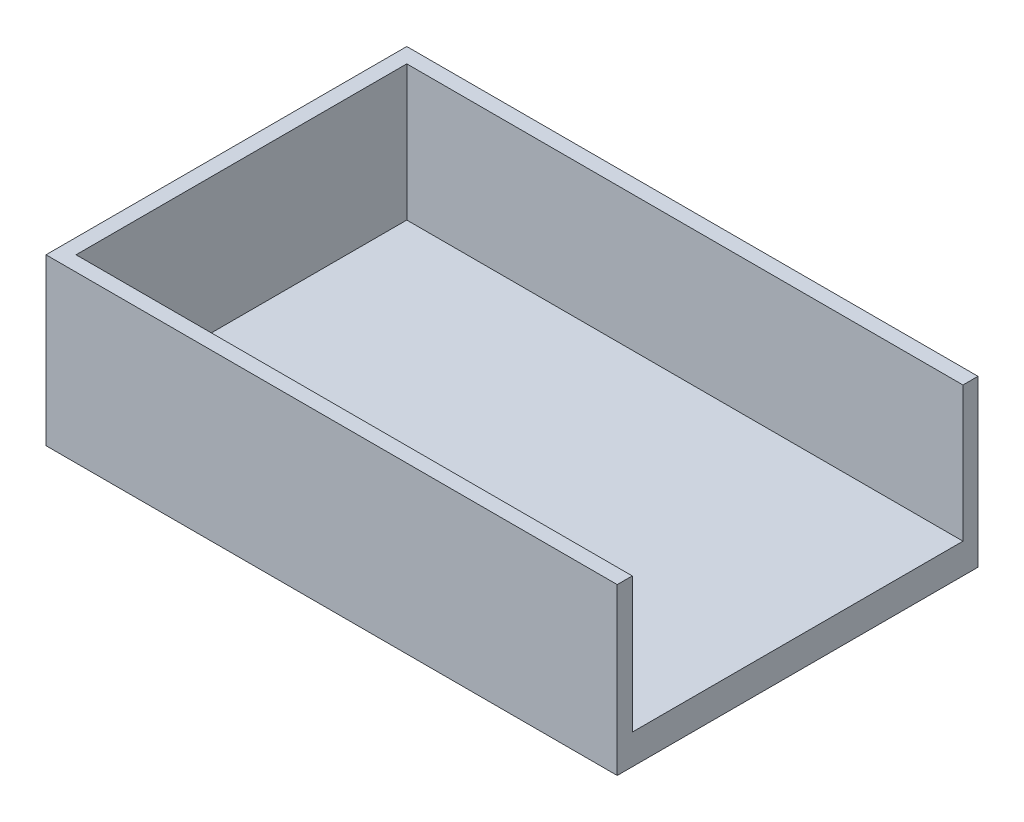
ISO-10303-21;
HEADER;
FILE_DESCRIPTION(('STEP AP214'),'2;1');
FILE_NAME('part.step','',(''),(''),'','','');
FILE_SCHEMA(('AUTOMOTIVE_DESIGN { 1 0 10303 214 1 1 1 1 }'));
ENDSEC;
DATA;
#1=APPLICATION_CONTEXT('core data for automotive mechanical design processes');
#2=APPLICATION_PROTOCOL_DEFINITION('international standard','automotive_design',2000,#1);
#3=PRODUCT_CONTEXT('',#1,'mechanical');
#4=PRODUCT('Part','Part','',(#3));
#5=PRODUCT_RELATED_PRODUCT_CATEGORY('part','',(#4));
#6=PRODUCT_DEFINITION_FORMATION('','',#4);
#7=PRODUCT_DEFINITION_CONTEXT('part definition',#1,'design');
#8=PRODUCT_DEFINITION('design','',#6,#7);
#9=PRODUCT_DEFINITION_SHAPE('','',#8);
#10=(LENGTH_UNIT() NAMED_UNIT(*) SI_UNIT(.MILLI.,.METRE.));
#11=(NAMED_UNIT(*) PLANE_ANGLE_UNIT() SI_UNIT($,.RADIAN.));
#12=(NAMED_UNIT(*) SI_UNIT($,.STERADIAN.) SOLID_ANGLE_UNIT());
#13=UNCERTAINTY_MEASURE_WITH_UNIT(LENGTH_MEASURE(1.E-05),#10,'distance_accuracy_value','');
#14=(GEOMETRIC_REPRESENTATION_CONTEXT(3) GLOBAL_UNCERTAINTY_ASSIGNED_CONTEXT((#13)) GLOBAL_UNIT_ASSIGNED_CONTEXT((#10,
#11,#12)) REPRESENTATION_CONTEXT('',''));
#15=CARTESIAN_POINT('',(0.,0.,0.));
#16=DIRECTION('',(0.,0.,1.));
#17=DIRECTION('',(1.,0.,0.));
#18=AXIS2_PLACEMENT_3D('',#15,#16,#17);
#19=CARTESIAN_POINT('',(0.,2.,0.));
#20=DIRECTION('',(0.,-1.,0.));
#21=DIRECTION('',(0.,0.,-1.));
#22=AXIS2_PLACEMENT_3D('',#19,#20,#21);
#23=PLANE('',#22);
#24=DIRECTION('',(1.,0.,0.));
#25=VECTOR('',#24,1.);
#26=CARTESIAN_POINT('',(3.,2.,-1.));
#27=LINE('',#26,#25);
#28=CARTESIAN_POINT('',(1.,2.,-1.));
#29=VERTEX_POINT('',#28);
#30=CARTESIAN_POINT('',(3.,2.,-1.));
#31=VERTEX_POINT('',#30);
#32=EDGE_CURVE('E197',#29,#31,#27,.T.);
#33=ORIENTED_EDGE('',*,*,#32,.T.);
#34=DIRECTION('',(0.,0.,1.));
#35=VECTOR('',#34,1.);
#36=CARTESIAN_POINT('',(3.,2.,-4.));
#37=LINE('',#36,#35);
#38=CARTESIAN_POINT('',(3.,2.,-4.));
#39=VERTEX_POINT('',#38);
#40=EDGE_CURVE('E151',#39,#31,#37,.T.);
#41=ORIENTED_EDGE('',*,*,#40,.F.);
#42=DIRECTION('',(-1.,0.,0.));
#43=VECTOR('',#42,1.);
#44=CARTESIAN_POINT('',(4.,2.,-4.));
#45=LINE('',#44,#43);
#46=CARTESIAN_POINT('',(8.,2.,-4.));
#47=VERTEX_POINT('',#46);
#48=EDGE_CURVE('E143',#47,#39,#45,.T.);
#49=ORIENTED_EDGE('',*,*,#48,.F.);
#50=DIRECTION('',(0.,0.,-1.));
#51=VECTOR('',#50,1.);
#52=CARTESIAN_POINT('',(8.,2.,-1.));
#53=LINE('',#52,#51);
#54=CARTESIAN_POINT('',(8.,2.,-1.));
#55=VERTEX_POINT('',#54);
#56=EDGE_CURVE('E61',#55,#47,#53,.T.);
#57=ORIENTED_EDGE('',*,*,#56,.F.);
#58=CARTESIAN_POINT('',(38.,2.,-1.));
#59=VERTEX_POINT('',#58);
#60=EDGE_CURVE('E188',#55,#59,#27,.T.);
#61=ORIENTED_EDGE('',*,*,#60,.T.);
#62=DIRECTION('',(0.,0.,1.));
#63=VECTOR('',#62,1.);
#64=CARTESIAN_POINT('',(38.,2.,0.));
#65=LINE('',#64,#63);
#66=CARTESIAN_POINT('',(38.,2.,-23.));
#67=VERTEX_POINT('',#66);
#68=EDGE_CURVE('E176',#67,#59,#65,.T.);
#69=ORIENTED_EDGE('',*,*,#68,.F.);
#70=DIRECTION('',(-1.,0.,0.));
#71=VECTOR('',#70,1.);
#72=CARTESIAN_POINT('',(3.,2.,-23.));
#73=LINE('',#72,#71);
#74=CARTESIAN_POINT('',(1.,2.,-23.));
#75=VERTEX_POINT('',#74);
#76=EDGE_CURVE('E194',#67,#75,#73,.T.);
#77=ORIENTED_EDGE('',*,*,#76,.T.);
#78=DIRECTION('',(0.,0.,-1.));
#79=VECTOR('',#78,1.);
#80=CARTESIAN_POINT('',(1.,2.,-1.));
#81=LINE('',#80,#79);
#82=EDGE_CURVE('E159',#29,#75,#81,.T.);
#83=ORIENTED_EDGE('',*,*,#82,.F.);
#84=EDGE_LOOP('',(#33,#41,#49,#57,#61,#69,#77,#83));
#85=FACE_BOUND('',#84,.T.);
#86=ADVANCED_FACE('F39',(#85),#23,.F.);
#87=CARTESIAN_POINT('',(0.,2.,0.));
#88=DIRECTION('',(0.,0.,-1.));
#89=DIRECTION('',(-1.,0.,0.));
#90=AXIS2_PLACEMENT_3D('',#87,#88,#89);
#91=PLANE('',#90);
#92=DIRECTION('',(0.,-1.,0.));
#93=VECTOR('',#92,1.);
#94=CARTESIAN_POINT('',(38.,11.,0.));
#95=LINE('',#94,#93);
#96=CARTESIAN_POINT('',(38.,11.,0.));
#97=VERTEX_POINT('',#96);
#98=CARTESIAN_POINT('',(38.,0.,0.));
#99=VERTEX_POINT('',#98);
#100=EDGE_CURVE('E168',#97,#99,#95,.T.);
#101=ORIENTED_EDGE('',*,*,#100,.F.);
#102=DIRECTION('',(1.,0.,0.));
#103=VECTOR('',#102,1.);
#104=CARTESIAN_POINT('',(0.,11.,0.));
#105=LINE('',#104,#103);
#106=CARTESIAN_POINT('',(0.,11.,0.));
#107=VERTEX_POINT('',#106);
#108=EDGE_CURVE('E203',#107,#97,#105,.T.);
#109=ORIENTED_EDGE('',*,*,#108,.F.);
#110=DIRECTION('',(0.,-1.,0.));
#111=VECTOR('',#110,1.);
#112=CARTESIAN_POINT('',(0.,2.,0.));
#113=LINE('',#112,#111);
#114=CARTESIAN_POINT('',(0.,0.,0.));
#115=VERTEX_POINT('',#114);
#116=EDGE_CURVE('E47',#107,#115,#113,.T.);
#117=ORIENTED_EDGE('',*,*,#116,.T.);
#118=DIRECTION('',(1.,0.,0.));
#119=VECTOR('',#118,1.);
#120=CARTESIAN_POINT('',(0.,0.,0.));
#121=LINE('',#120,#119);
#122=EDGE_CURVE('E211',#115,#99,#121,.T.);
#123=ORIENTED_EDGE('',*,*,#122,.T.);
#124=EDGE_LOOP('',(#101,#109,#117,#123));
#125=FACE_BOUND('',#124,.T.);
#126=ADVANCED_FACE('F222',(#125),#91,.F.);
#127=CARTESIAN_POINT('',(0.,2.,-24.));
#128=DIRECTION('',(0.,0.,1.));
#129=DIRECTION('',(1.,0.,0.));
#130=AXIS2_PLACEMENT_3D('',#127,#128,#129);
#131=PLANE('',#130);
#132=DIRECTION('',(0.,1.,0.));
#133=VECTOR('',#132,1.);
#134=CARTESIAN_POINT('',(38.,11.,-24.));
#135=LINE('',#134,#133);
#136=CARTESIAN_POINT('',(38.,0.,-24.));
#137=VERTEX_POINT('',#136);
#138=CARTESIAN_POINT('',(38.,11.,-24.));
#139=VERTEX_POINT('',#138);
#140=EDGE_CURVE('E172',#137,#139,#135,.T.);
#141=ORIENTED_EDGE('',*,*,#140,.F.);
#142=DIRECTION('',(-1.,0.,0.));
#143=VECTOR('',#142,1.);
#144=CARTESIAN_POINT('',(0.,0.,-24.));
#145=LINE('',#144,#143);
#146=CARTESIAN_POINT('',(0.,0.,-24.));
#147=VERTEX_POINT('',#146);
#148=EDGE_CURVE('E214',#137,#147,#145,.T.);
#149=ORIENTED_EDGE('',*,*,#148,.T.);
#150=DIRECTION('',(0.,-1.,0.));
#151=VECTOR('',#150,1.);
#152=CARTESIAN_POINT('',(0.,2.,-24.));
#153=LINE('',#152,#151);
#154=CARTESIAN_POINT('',(0.,11.,-24.));
#155=VERTEX_POINT('',#154);
#156=EDGE_CURVE('E216',#155,#147,#153,.T.);
#157=ORIENTED_EDGE('',*,*,#156,.F.);
#158=DIRECTION('',(-1.,0.,0.));
#159=VECTOR('',#158,1.);
#160=CARTESIAN_POINT('',(0.,11.,-24.));
#161=LINE('',#160,#159);
#162=EDGE_CURVE('E206',#139,#155,#161,.T.);
#163=ORIENTED_EDGE('',*,*,#162,.F.);
#164=EDGE_LOOP('',(#141,#149,#157,#163));
#165=FACE_BOUND('',#164,.T.);
#166=ADVANCED_FACE('F233',(#165),#131,.F.);
#167=CARTESIAN_POINT('',(0.,0.,0.));
#168=DIRECTION('',(0.,-1.,0.));
#169=DIRECTION('',(0.,0.,-1.));
#170=AXIS2_PLACEMENT_3D('',#167,#168,#169);
#171=PLANE('',#170);
#172=DIRECTION('',(0.,0.,1.));
#173=VECTOR('',#172,1.);
#174=CARTESIAN_POINT('',(3.,0.,-4.));
#175=LINE('',#174,#173);
#176=CARTESIAN_POINT('',(3.,0.,-4.));
#177=VERTEX_POINT('',#176);
#178=CARTESIAN_POINT('',(3.,0.,-1.));
#179=VERTEX_POINT('',#178);
#180=EDGE_CURVE('E134',#177,#179,#175,.T.);
#181=ORIENTED_EDGE('',*,*,#180,.T.);
#182=DIRECTION('',(1.,0.,0.));
#183=VECTOR('',#182,1.);
#184=CARTESIAN_POINT('',(4.,0.,-1.));
#185=LINE('',#184,#183);
#186=CARTESIAN_POINT('',(8.,0.,-1.));
#187=VERTEX_POINT('',#186);
#188=EDGE_CURVE('E181',#179,#187,#185,.T.);
#189=ORIENTED_EDGE('',*,*,#188,.T.);
#190=DIRECTION('',(0.,0.,-1.));
#191=VECTOR('',#190,1.);
#192=CARTESIAN_POINT('',(8.,0.,-1.));
#193=LINE('',#192,#191);
#194=CARTESIAN_POINT('',(8.,0.,-4.));
#195=VERTEX_POINT('',#194);
#196=EDGE_CURVE('E135',#187,#195,#193,.T.);
#197=ORIENTED_EDGE('',*,*,#196,.T.);
#198=DIRECTION('',(-1.,0.,0.));
#199=VECTOR('',#198,1.);
#200=CARTESIAN_POINT('',(4.,0.,-4.));
#201=LINE('',#200,#199);
#202=EDGE_CURVE('E128',#195,#177,#201,.T.);
#203=ORIENTED_EDGE('',*,*,#202,.T.);
#204=EDGE_LOOP('',(#181,#189,#197,#203));
#205=FACE_BOUND('',#204,.T.);
#206=ORIENTED_EDGE('',*,*,#148,.F.);
#207=DIRECTION('',(0.,0.,-1.));
#208=VECTOR('',#207,1.);
#209=CARTESIAN_POINT('',(38.,0.,0.));
#210=LINE('',#209,#208);
#211=EDGE_CURVE('E170',#99,#137,#210,.T.);
#212=ORIENTED_EDGE('',*,*,#211,.F.);
#213=ORIENTED_EDGE('',*,*,#122,.F.);
#214=DIRECTION('',(0.,0.,1.));
#215=VECTOR('',#214,1.);
#216=CARTESIAN_POINT('',(0.,0.,0.));
#217=LINE('',#216,#215);
#218=EDGE_CURVE('E208',#147,#115,#217,.T.);
#219=ORIENTED_EDGE('',*,*,#218,.F.);
#220=EDGE_LOOP('',(#206,#212,#213,#219));
#221=FACE_BOUND('',#220,.T.);
#222=ADVANCED_FACE('F130',(#205,#221),#171,.T.);
#223=CARTESIAN_POINT('',(0.,11.,0.));
#224=DIRECTION('',(0.,1.,0.));
#225=DIRECTION('',(0.,0.,1.));
#226=AXIS2_PLACEMENT_3D('',#223,#224,#225);
#227=PLANE('',#226);
#228=DIRECTION('',(1.,0.,0.));
#229=VECTOR('',#228,1.);
#230=CARTESIAN_POINT('',(3.,11.,-1.));
#231=LINE('',#230,#229);
#232=CARTESIAN_POINT('',(1.,11.,-1.));
#233=VERTEX_POINT('',#232);
#234=CARTESIAN_POINT('',(38.,11.,-1.));
#235=VERTEX_POINT('',#234);
#236=EDGE_CURVE('E190',#233,#235,#231,.T.);
#237=ORIENTED_EDGE('',*,*,#236,.F.);
#238=DIRECTION('',(0.,0.,1.));
#239=VECTOR('',#238,1.);
#240=CARTESIAN_POINT('',(1.,11.,-1.));
#241=LINE('',#240,#239);
#242=CARTESIAN_POINT('',(1.,11.,-23.));
#243=VERTEX_POINT('',#242);
#244=EDGE_CURVE('E165',#243,#233,#241,.T.);
#245=ORIENTED_EDGE('',*,*,#244,.F.);
#246=DIRECTION('',(-1.,0.,0.));
#247=VECTOR('',#246,1.);
#248=CARTESIAN_POINT('',(3.,11.,-23.));
#249=LINE('',#248,#247);
#250=CARTESIAN_POINT('',(38.,11.,-23.));
#251=VERTEX_POINT('',#250);
#252=EDGE_CURVE('E193',#251,#243,#249,.T.);
#253=ORIENTED_EDGE('',*,*,#252,.F.);
#254=DIRECTION('',(0.,0.,1.));
#255=VECTOR('',#254,1.);
#256=CARTESIAN_POINT('',(38.,11.,0.));
#257=LINE('',#256,#255);
#258=EDGE_CURVE('E54',#139,#251,#257,.T.);
#259=ORIENTED_EDGE('',*,*,#258,.F.);
#260=ORIENTED_EDGE('',*,*,#162,.T.);
#261=DIRECTION('',(0.,0.,1.));
#262=VECTOR('',#261,1.);
#263=CARTESIAN_POINT('',(0.,11.,-24.));
#264=LINE('',#263,#262);
#265=EDGE_CURVE('E196',#155,#107,#264,.T.);
#266=ORIENTED_EDGE('',*,*,#265,.T.);
#267=ORIENTED_EDGE('',*,*,#108,.T.);
#268=EDGE_CURVE('E174',#235,#97,#257,.T.);
#269=ORIENTED_EDGE('',*,*,#268,.F.);
#270=EDGE_LOOP('',(#237,#245,#253,#259,#260,#266,#267,#269));
#271=FACE_BOUND('',#270,.T.);
#272=ADVANCED_FACE('F235',(#271),#227,.T.);
#273=CARTESIAN_POINT('',(3.,11.,-1.));
#274=DIRECTION('',(0.,0.,-1.));
#275=DIRECTION('',(-1.,0.,0.));
#276=AXIS2_PLACEMENT_3D('',#273,#274,#275);
#277=PLANE('',#276);
#278=ORIENTED_EDGE('',*,*,#236,.T.);
#279=DIRECTION('',(0.,-1.,0.));
#280=VECTOR('',#279,1.);
#281=CARTESIAN_POINT('',(38.,11.,-1.));
#282=LINE('',#281,#280);
#283=EDGE_CURVE('E178',#235,#59,#282,.T.);
#284=ORIENTED_EDGE('',*,*,#283,.T.);
#285=ORIENTED_EDGE('',*,*,#60,.F.);
#286=DIRECTION('',(0.,1.,0.));
#287=VECTOR('',#286,1.);
#288=CARTESIAN_POINT('',(8.,0.,-1.));
#289=LINE('',#288,#287);
#290=EDGE_CURVE('E137',#187,#55,#289,.T.);
#291=ORIENTED_EDGE('',*,*,#290,.F.);
#292=ORIENTED_EDGE('',*,*,#188,.F.);
#293=DIRECTION('',(0.,1.,0.));
#294=VECTOR('',#293,1.);
#295=CARTESIAN_POINT('',(3.,0.,-1.));
#296=LINE('',#295,#294);
#297=EDGE_CURVE('E147',#179,#31,#296,.T.);
#298=ORIENTED_EDGE('',*,*,#297,.T.);
#299=ORIENTED_EDGE('',*,*,#32,.F.);
#300=DIRECTION('',(0.,-1.,0.));
#301=VECTOR('',#300,1.);
#302=CARTESIAN_POINT('',(1.,2.,-1.));
#303=LINE('',#302,#301);
#304=EDGE_CURVE('E155',#233,#29,#303,.T.);
#305=ORIENTED_EDGE('',*,*,#304,.F.);
#306=EDGE_LOOP('',(#278,#284,#285,#291,#292,#298,#299,#305));
#307=FACE_BOUND('',#306,.T.);
#308=ADVANCED_FACE('F252',(#307),#277,.T.);
#309=CARTESIAN_POINT('',(3.,11.,-23.));
#310=DIRECTION('',(0.,0.,1.));
#311=DIRECTION('',(1.,0.,0.));
#312=AXIS2_PLACEMENT_3D('',#309,#310,#311);
#313=PLANE('',#312);
#314=ORIENTED_EDGE('',*,*,#76,.F.);
#315=DIRECTION('',(0.,1.,0.));
#316=VECTOR('',#315,1.);
#317=CARTESIAN_POINT('',(38.,11.,-23.));
#318=LINE('',#317,#316);
#319=EDGE_CURVE('E11',#67,#251,#318,.T.);
#320=ORIENTED_EDGE('',*,*,#319,.T.);
#321=ORIENTED_EDGE('',*,*,#252,.T.);
#322=DIRECTION('',(0.,1.,0.));
#323=VECTOR('',#322,1.);
#324=CARTESIAN_POINT('',(1.,2.,-23.));
#325=LINE('',#324,#323);
#326=EDGE_CURVE('E162',#75,#243,#325,.T.);
#327=ORIENTED_EDGE('',*,*,#326,.F.);
#328=EDGE_LOOP('',(#314,#320,#321,#327));
#329=FACE_BOUND('',#328,.T.);
#330=ADVANCED_FACE('F241',(#329),#313,.T.);
#331=CARTESIAN_POINT('',(0.,2.,0.));
#332=DIRECTION('',(1.,0.,0.));
#333=DIRECTION('',(0.,0.,-1.));
#334=AXIS2_PLACEMENT_3D('',#331,#332,#333);
#335=PLANE('',#334);
#336=ORIENTED_EDGE('',*,*,#218,.T.);
#337=ORIENTED_EDGE('',*,*,#116,.F.);
#338=ORIENTED_EDGE('',*,*,#265,.F.);
#339=ORIENTED_EDGE('',*,*,#156,.T.);
#340=EDGE_LOOP('',(#336,#337,#338,#339));
#341=FACE_BOUND('',#340,.T.);
#342=ADVANCED_FACE('F41',(#341),#335,.F.);
#343=CARTESIAN_POINT('',(4.,0.,-4.));
#344=DIRECTION('',(0.,0.,-1.));
#345=DIRECTION('',(-1.,0.,0.));
#346=AXIS2_PLACEMENT_3D('',#343,#344,#345);
#347=PLANE('',#346);
#348=ORIENTED_EDGE('',*,*,#48,.T.);
#349=DIRECTION('',(0.,1.,0.));
#350=VECTOR('',#349,1.);
#351=CARTESIAN_POINT('',(3.,0.,-4.));
#352=LINE('',#351,#350);
#353=EDGE_CURVE('E140',#177,#39,#352,.T.);
#354=ORIENTED_EDGE('',*,*,#353,.F.);
#355=ORIENTED_EDGE('',*,*,#202,.F.);
#356=DIRECTION('',(0.,1.,0.));
#357=VECTOR('',#356,1.);
#358=CARTESIAN_POINT('',(8.,0.,-4.));
#359=LINE('',#358,#357);
#360=EDGE_CURVE('E186',#195,#47,#359,.T.);
#361=ORIENTED_EDGE('',*,*,#360,.T.);
#362=EDGE_LOOP('',(#348,#354,#355,#361));
#363=FACE_BOUND('',#362,.T.);
#364=ADVANCED_FACE('F141',(#363),#347,.F.);
#365=CARTESIAN_POINT('',(8.,0.,-1.));
#366=DIRECTION('',(1.,0.,0.));
#367=DIRECTION('',(0.,0.,-1.));
#368=AXIS2_PLACEMENT_3D('',#365,#366,#367);
#369=PLANE('',#368);
#370=ORIENTED_EDGE('',*,*,#56,.T.);
#371=ORIENTED_EDGE('',*,*,#360,.F.);
#372=ORIENTED_EDGE('',*,*,#196,.F.);
#373=ORIENTED_EDGE('',*,*,#290,.T.);
#374=EDGE_LOOP('',(#370,#371,#372,#373));
#375=FACE_BOUND('',#374,.T.);
#376=ADVANCED_FACE('F254',(#375),#369,.F.);
#377=CARTESIAN_POINT('',(38.,0.,0.));
#378=DIRECTION('',(1.,0.,0.));
#379=DIRECTION('',(0.,0.,-1.));
#380=AXIS2_PLACEMENT_3D('',#377,#378,#379);
#381=PLANE('',#380);
#382=ORIENTED_EDGE('',*,*,#268,.T.);
#383=ORIENTED_EDGE('',*,*,#100,.T.);
#384=ORIENTED_EDGE('',*,*,#211,.T.);
#385=ORIENTED_EDGE('',*,*,#140,.T.);
#386=ORIENTED_EDGE('',*,*,#258,.T.);
#387=ORIENTED_EDGE('',*,*,#319,.F.);
#388=ORIENTED_EDGE('',*,*,#68,.T.);
#389=ORIENTED_EDGE('',*,*,#283,.F.);
#390=EDGE_LOOP('',(#382,#383,#384,#385,#386,#387,#388,#389));
#391=FACE_BOUND('',#390,.T.);
#392=ADVANCED_FACE('F230',(#391),#381,.T.);
#393=CARTESIAN_POINT('',(1.,0.,0.));
#394=DIRECTION('',(-1.,0.,0.));
#395=DIRECTION('',(0.,0.,1.));
#396=AXIS2_PLACEMENT_3D('',#393,#394,#395);
#397=PLANE('',#396);
#398=ORIENTED_EDGE('',*,*,#304,.T.);
#399=ORIENTED_EDGE('',*,*,#82,.T.);
#400=ORIENTED_EDGE('',*,*,#326,.T.);
#401=ORIENTED_EDGE('',*,*,#244,.T.);
#402=EDGE_LOOP('',(#398,#399,#400,#401));
#403=FACE_BOUND('',#402,.T.);
#404=ADVANCED_FACE('F243',(#403),#397,.F.);
#405=CARTESIAN_POINT('',(3.,0.,-4.));
#406=DIRECTION('',(-1.,0.,0.));
#407=DIRECTION('',(0.,0.,1.));
#408=AXIS2_PLACEMENT_3D('',#405,#406,#407);
#409=PLANE('',#408);
#410=ORIENTED_EDGE('',*,*,#40,.T.);
#411=ORIENTED_EDGE('',*,*,#297,.F.);
#412=ORIENTED_EDGE('',*,*,#180,.F.);
#413=ORIENTED_EDGE('',*,*,#353,.T.);
#414=EDGE_LOOP('',(#410,#411,#412,#413));
#415=FACE_BOUND('',#414,.T.);
#416=ADVANCED_FACE('F150',(#415),#409,.F.);
#417=CLOSED_SHELL('',(#86,#126,#166,#222,#272,#308,#330,#342,#364,#376,#392,#404,#416));
#418=MANIFOLD_SOLID_BREP('B2',#417);
#419=ADVANCED_BREP_SHAPE_REPRESENTATION('',(#18,#418),#14);
#420=SHAPE_DEFINITION_REPRESENTATION(#9,#419);
ENDSEC;
END-ISO-10303-21;
